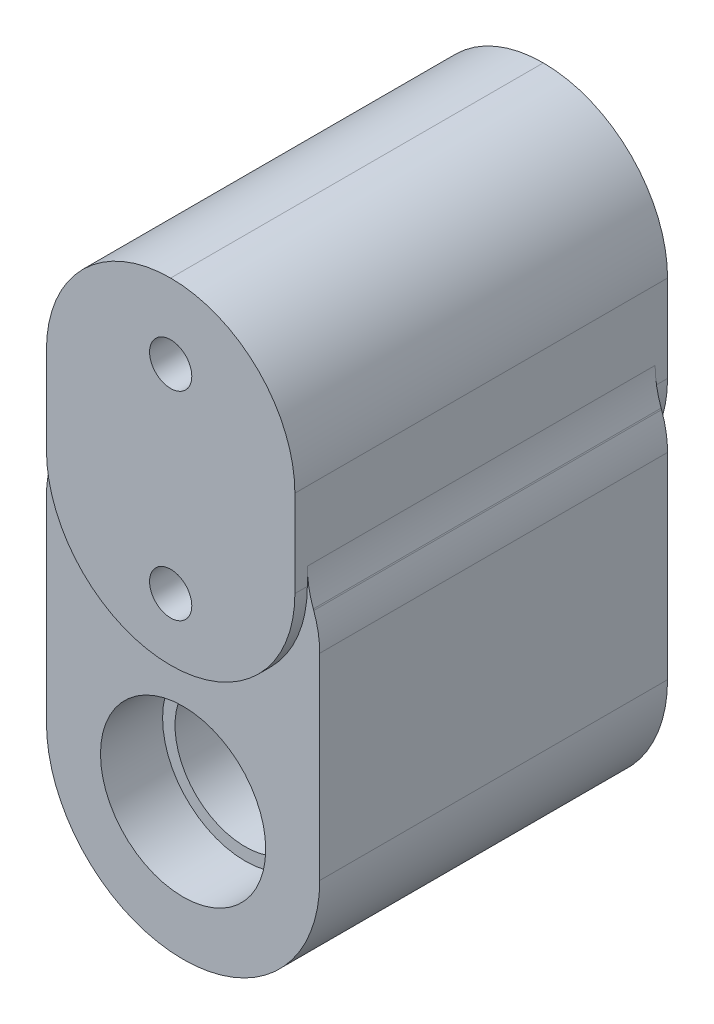
ISO-10303-21;
HEADER;
FILE_DESCRIPTION(('STEP AP214'),'2;1');
FILE_NAME('part.step','',(''),(''),'','','');
FILE_SCHEMA(('AUTOMOTIVE_DESIGN { 1 0 10303 214 1 1 1 1 }'));
ENDSEC;
DATA;
#1=APPLICATION_CONTEXT('core data for automotive mechanical design processes');
#2=APPLICATION_PROTOCOL_DEFINITION('international standard','automotive_design',2000,#1);
#3=PRODUCT_CONTEXT('',#1,'mechanical');
#4=PRODUCT('Part','Part','',(#3));
#5=PRODUCT_RELATED_PRODUCT_CATEGORY('part','',(#4));
#6=PRODUCT_DEFINITION_FORMATION('','',#4);
#7=PRODUCT_DEFINITION_CONTEXT('part definition',#1,'design');
#8=PRODUCT_DEFINITION('design','',#6,#7);
#9=PRODUCT_DEFINITION_SHAPE('','',#8);
#10=(LENGTH_UNIT() NAMED_UNIT(*) SI_UNIT(.MILLI.,.METRE.));
#11=(NAMED_UNIT(*) PLANE_ANGLE_UNIT() SI_UNIT($,.RADIAN.));
#12=(NAMED_UNIT(*) SI_UNIT($,.STERADIAN.) SOLID_ANGLE_UNIT());
#13=UNCERTAINTY_MEASURE_WITH_UNIT(LENGTH_MEASURE(1.E-05),#10,'distance_accuracy_value','');
#14=(GEOMETRIC_REPRESENTATION_CONTEXT(3) GLOBAL_UNCERTAINTY_ASSIGNED_CONTEXT((#13)) GLOBAL_UNIT_ASSIGNED_CONTEXT((#10,
#11,#12)) REPRESENTATION_CONTEXT('',''));
#15=CARTESIAN_POINT('',(0.,0.,0.));
#16=DIRECTION('',(0.,0.,1.));
#17=DIRECTION('',(1.,0.,0.));
#18=AXIS2_PLACEMENT_3D('',#15,#16,#17);
#19=CARTESIAN_POINT('',(0.,0.,-14.));
#20=DIRECTION('',(0.,0.,1.));
#21=DIRECTION('',(1.,0.,0.));
#22=AXIS2_PLACEMENT_3D('',#19,#20,#21);
#23=CYLINDRICAL_SURFACE('',#22,5.65);
#24=CARTESIAN_POINT('',(0.,0.,9.));
#25=DIRECTION('',(0.,0.,1.));
#26=DIRECTION('',(1.,0.,0.));
#27=AXIS2_PLACEMENT_3D('',#24,#25,#26);
#28=CIRCLE('',#27,5.65);
#29=CARTESIAN_POINT('',(5.65,0.,9.));
#30=VERTEX_POINT('',#29);
#31=EDGE_CURVE('E207',#30,#30,#28,.T.);
#32=ORIENTED_EDGE('',*,*,#31,.T.);
#33=EDGE_LOOP('',(#32));
#34=FACE_BOUND('',#33,.T.);
#35=CARTESIAN_POINT('',(0.,0.,-9.));
#36=DIRECTION('',(0.,0.,-1.));
#37=DIRECTION('',(-1.,0.,0.));
#38=AXIS2_PLACEMENT_3D('',#35,#36,#37);
#39=CIRCLE('',#38,5.65);
#40=CARTESIAN_POINT('',(-5.65,0.,-9.));
#41=VERTEX_POINT('',#40);
#42=EDGE_CURVE('E204',#41,#41,#39,.F.);
#43=ORIENTED_EDGE('',*,*,#42,.F.);
#44=EDGE_LOOP('',(#43));
#45=FACE_BOUND('',#44,.T.);
#46=ADVANCED_FACE('F37',(#34,#45),#23,.F.);
#47=CARTESIAN_POINT('',(11.,37.,-14.));
#48=DIRECTION('',(1.,0.,0.));
#49=DIRECTION('',(0.,1.,0.));
#50=AXIS2_PLACEMENT_3D('',#47,#48,#49);
#51=PLANE('',#50);
#52=DIRECTION('',(0.,1.,0.));
#53=VECTOR('',#52,1.);
#54=CARTESIAN_POINT('',(11.,37.,-14.));
#55=LINE('',#54,#53);
#56=CARTESIAN_POINT('',(11.,0.,-14.));
#57=VERTEX_POINT('',#56);
#58=CARTESIAN_POINT('',(11.,15.8419067348776,-14.));
#59=VERTEX_POINT('',#58);
#60=EDGE_CURVE('E220',#57,#59,#55,.T.);
#61=ORIENTED_EDGE('',*,*,#60,.T.);
#62=DIRECTION('',(0.,0.,1.));
#63=VECTOR('',#62,1.);
#64=CARTESIAN_POINT('',(11.,15.8419067348776,14.));
#65=LINE('',#64,#63);
#66=CARTESIAN_POINT('',(11.,15.8419067348776,14.));
#67=VERTEX_POINT('',#66);
#68=EDGE_CURVE('E253',#59,#67,#65,.T.);
#69=ORIENTED_EDGE('',*,*,#68,.T.);
#70=DIRECTION('',(0.,1.,0.));
#71=VECTOR('',#70,1.);
#72=CARTESIAN_POINT('',(11.,37.,14.));
#73=LINE('',#72,#71);
#74=CARTESIAN_POINT('',(11.,0.,14.));
#75=VERTEX_POINT('',#74);
#76=EDGE_CURVE('E214',#75,#67,#73,.T.);
#77=ORIENTED_EDGE('',*,*,#76,.F.);
#78=DIRECTION('',(0.,0.,1.));
#79=VECTOR('',#78,1.);
#80=CARTESIAN_POINT('',(11.,0.,-14.));
#81=LINE('',#80,#79);
#82=EDGE_CURVE('E231',#75,#57,#81,.F.);
#83=ORIENTED_EDGE('',*,*,#82,.T.);
#84=EDGE_LOOP('',(#61,#69,#77,#83));
#85=FACE_BOUND('',#84,.T.);
#86=ADVANCED_FACE('F388',(#85),#51,.T.);
#87=CARTESIAN_POINT('',(-11.,37.,-14.));
#88=DIRECTION('',(-1.,0.,0.));
#89=DIRECTION('',(0.,-1.,0.));
#90=AXIS2_PLACEMENT_3D('',#87,#88,#89);
#91=PLANE('',#90);
#92=DIRECTION('',(0.,-1.,0.));
#93=VECTOR('',#92,1.);
#94=CARTESIAN_POINT('',(-11.,37.,14.));
#95=LINE('',#94,#93);
#96=CARTESIAN_POINT('',(-11.,15.8419067348776,14.));
#97=VERTEX_POINT('',#96);
#98=CARTESIAN_POINT('',(-11.,0.,14.));
#99=VERTEX_POINT('',#98);
#100=EDGE_CURVE('E218',#97,#99,#95,.T.);
#101=ORIENTED_EDGE('',*,*,#100,.F.);
#102=DIRECTION('',(0.,0.,1.));
#103=VECTOR('',#102,1.);
#104=CARTESIAN_POINT('',(-11.,15.8419067348776,-14.));
#105=LINE('',#104,#103);
#106=CARTESIAN_POINT('',(-11.,15.8419067348776,-14.));
#107=VERTEX_POINT('',#106);
#108=EDGE_CURVE('E271',#97,#107,#105,.F.);
#109=ORIENTED_EDGE('',*,*,#108,.T.);
#110=DIRECTION('',(0.,-1.,0.));
#111=VECTOR('',#110,1.);
#112=CARTESIAN_POINT('',(-11.,37.,-14.));
#113=LINE('',#112,#111);
#114=CARTESIAN_POINT('',(-11.,0.,-14.));
#115=VERTEX_POINT('',#114);
#116=EDGE_CURVE('E223',#107,#115,#113,.T.);
#117=ORIENTED_EDGE('',*,*,#116,.T.);
#118=DIRECTION('',(0.,0.,1.));
#119=VECTOR('',#118,1.);
#120=CARTESIAN_POINT('',(-11.,0.,-14.));
#121=LINE('',#120,#119);
#122=EDGE_CURVE('E239',#115,#99,#121,.T.);
#123=ORIENTED_EDGE('',*,*,#122,.T.);
#124=EDGE_LOOP('',(#101,#109,#117,#123));
#125=FACE_BOUND('',#124,.T.);
#126=ADVANCED_FACE('F375',(#125),#91,.T.);
#127=CARTESIAN_POINT('',(0.,0.,-14.));
#128=DIRECTION('',(0.,0.,1.));
#129=DIRECTION('',(1.,0.,0.));
#130=AXIS2_PLACEMENT_3D('',#127,#128,#129);
#131=PLANE('',#130);
#132=CARTESIAN_POINT('',(0.,0.,-14.));
#133=DIRECTION('',(0.,0.,1.));
#134=DIRECTION('',(1.,0.,0.));
#135=AXIS2_PLACEMENT_3D('',#132,#133,#134);
#136=CIRCLE('',#135,6.65);
#137=CARTESIAN_POINT('',(6.65,0.,-14.));
#138=VERTEX_POINT('',#137);
#139=EDGE_CURVE('E196',#138,#138,#136,.T.);
#140=ORIENTED_EDGE('',*,*,#139,.T.);
#141=EDGE_LOOP('',(#140));
#142=FACE_BOUND('',#141,.T.);
#143=DIRECTION('',(-0.342020143325663,0.93969262078591,0.));
#144=VECTOR('',#143,1.);
#145=CARTESIAN_POINT('',(11.,17.2525225805453,-14.));
#146=LINE('',#145,#144);
#147=CARTESIAN_POINT('',(10.5175409662873,18.5780678814829,-14.));
#148=VERTEX_POINT('',#147);
#149=CARTESIAN_POINT('',(10.4824590337127,18.6744546990624,-14.));
#150=VERTEX_POINT('',#149);
#151=EDGE_CURVE('E305',#148,#150,#146,.T.);
#152=ORIENTED_EDGE('',*,*,#151,.F.);
#153=CARTESIAN_POINT('',(3.,15.8419067348776,-14.));
#154=DIRECTION('',(0.,0.,1.));
#155=DIRECTION('',(1.,0.,0.));
#156=AXIS2_PLACEMENT_3D('',#153,#154,#155);
#157=CIRCLE('',#156,8.);
#158=EDGE_CURVE('E262',#148,#59,#157,.F.);
#159=ORIENTED_EDGE('',*,*,#158,.T.);
#160=ORIENTED_EDGE('',*,*,#60,.F.);
#161=CARTESIAN_POINT('',(0.,0.,-14.));
#162=DIRECTION('',(0.,0.,1.));
#163=DIRECTION('',(1.,0.,0.));
#164=AXIS2_PLACEMENT_3D('',#161,#162,#163);
#165=CIRCLE('',#164,11.);
#166=CARTESIAN_POINT('',(0.,-11.,-14.));
#167=VERTEX_POINT('',#166);
#168=EDGE_CURVE('E237',#57,#167,#165,.F.);
#169=ORIENTED_EDGE('',*,*,#168,.T.);
#170=CARTESIAN_POINT('',(0.,0.,-14.));
#171=DIRECTION('',(0.,0.,1.));
#172=DIRECTION('',(1.,0.,0.));
#173=AXIS2_PLACEMENT_3D('',#170,#171,#172);
#174=CIRCLE('',#173,11.);
#175=EDGE_CURVE('E234',#167,#115,#174,.F.);
#176=ORIENTED_EDGE('',*,*,#175,.T.);
#177=ORIENTED_EDGE('',*,*,#116,.F.);
#178=CARTESIAN_POINT('',(-3.,15.8419067348776,-14.));
#179=DIRECTION('',(0.,0.,1.));
#180=DIRECTION('',(1.,0.,0.));
#181=AXIS2_PLACEMENT_3D('',#178,#179,#180);
#182=CIRCLE('',#181,8.);
#183=CARTESIAN_POINT('',(-10.5175409662873,18.5780678814829,-14.));
#184=VERTEX_POINT('',#183);
#185=EDGE_CURVE('E260',#107,#184,#182,.F.);
#186=ORIENTED_EDGE('',*,*,#185,.T.);
#187=DIRECTION('',(-0.342020143325663,-0.93969262078591,0.));
#188=VECTOR('',#187,1.);
#189=CARTESIAN_POINT('',(-11.,17.2525225805453,-14.));
#190=LINE('',#189,#188);
#191=CARTESIAN_POINT('',(-10.4824590337127,18.6744546990624,-14.));
#192=VERTEX_POINT('',#191);
#193=EDGE_CURVE('E313',#192,#184,#190,.T.);
#194=ORIENTED_EDGE('',*,*,#193,.F.);
#195=CARTESIAN_POINT('',(-18.,21.4106158456677,-14.));
#196=DIRECTION('',(0.,0.,1.));
#197=DIRECTION('',(1.,0.,0.));
#198=AXIS2_PLACEMENT_3D('',#195,#196,#197);
#199=CIRCLE('',#198,8.);
#200=CARTESIAN_POINT('',(-10.,21.4106158456677,-14.));
#201=VERTEX_POINT('',#200);
#202=EDGE_CURVE('E279',#192,#201,#199,.T.);
#203=ORIENTED_EDGE('',*,*,#202,.T.);
#204=DIRECTION('',(0.,1.,0.));
#205=VECTOR('',#204,1.);
#206=CARTESIAN_POINT('',(-10.,0.,-14.));
#207=LINE('',#206,#205);
#208=CARTESIAN_POINT('',(-10.,20.,-14.));
#209=VERTEX_POINT('',#208);
#210=EDGE_CURVE('E264',#209,#201,#207,.T.);
#211=ORIENTED_EDGE('',*,*,#210,.F.);
#212=CARTESIAN_POINT('',(0.,20.,-14.));
#213=DIRECTION('',(0.,0.,1.));
#214=DIRECTION('',(1.,0.,0.));
#215=AXIS2_PLACEMENT_3D('',#212,#213,#214);
#216=CIRCLE('',#215,10.);
#217=CARTESIAN_POINT('',(10.,20.,-14.));
#218=VERTEX_POINT('',#217);
#219=EDGE_CURVE('E325',#209,#218,#216,.T.);
#220=ORIENTED_EDGE('',*,*,#219,.T.);
#221=DIRECTION('',(0.,-1.,0.));
#222=VECTOR('',#221,1.);
#223=CARTESIAN_POINT('',(10.,0.,-14.));
#224=LINE('',#223,#222);
#225=CARTESIAN_POINT('',(10.,21.4106158456677,-14.));
#226=VERTEX_POINT('',#225);
#227=EDGE_CURVE('E247',#226,#218,#224,.T.);
#228=ORIENTED_EDGE('',*,*,#227,.F.);
#229=CARTESIAN_POINT('',(18.,21.4106158456677,-14.));
#230=DIRECTION('',(0.,0.,1.));
#231=DIRECTION('',(1.,0.,0.));
#232=AXIS2_PLACEMENT_3D('',#229,#230,#231);
#233=CIRCLE('',#232,8.);
#234=EDGE_CURVE('E275',#226,#150,#233,.T.);
#235=ORIENTED_EDGE('',*,*,#234,.T.);
#236=EDGE_LOOP('',(#152,#159,#160,#169,#176,#177,#186,#194,#203,#211,#220,#228,#235));
#237=FACE_BOUND('',#236,.T.);
#238=ADVANCED_FACE('F352',(#142,#237),#131,.F.);
#239=CARTESIAN_POINT('',(0.,0.,14.));
#240=DIRECTION('',(0.,0.,1.));
#241=DIRECTION('',(1.,0.,0.));
#242=AXIS2_PLACEMENT_3D('',#239,#240,#241);
#243=PLANE('',#242);
#244=ORIENTED_EDGE('',*,*,#76,.T.);
#245=CARTESIAN_POINT('',(3.,15.8419067348776,14.));
#246=DIRECTION('',(0.,0.,1.));
#247=DIRECTION('',(1.,0.,0.));
#248=AXIS2_PLACEMENT_3D('',#245,#246,#247);
#249=CIRCLE('',#248,8.);
#250=CARTESIAN_POINT('',(10.5175409662873,18.5780678814829,14.));
#251=VERTEX_POINT('',#250);
#252=EDGE_CURVE('E258',#67,#251,#249,.T.);
#253=ORIENTED_EDGE('',*,*,#252,.T.);
#254=DIRECTION('',(0.342020143325663,-0.93969262078591,0.));
#255=VECTOR('',#254,1.);
#256=CARTESIAN_POINT('',(11.,17.2525225805453,14.));
#257=LINE('',#256,#255);
#258=CARTESIAN_POINT('',(10.4824590337127,18.6744546990624,14.));
#259=VERTEX_POINT('',#258);
#260=EDGE_CURVE('E307',#259,#251,#257,.T.);
#261=ORIENTED_EDGE('',*,*,#260,.F.);
#262=CARTESIAN_POINT('',(18.,21.4106158456677,14.));
#263=DIRECTION('',(0.,0.,1.));
#264=DIRECTION('',(1.,0.,0.));
#265=AXIS2_PLACEMENT_3D('',#262,#263,#264);
#266=CIRCLE('',#265,8.);
#267=CARTESIAN_POINT('',(10.,21.4106158456677,14.));
#268=VERTEX_POINT('',#267);
#269=EDGE_CURVE('E273',#259,#268,#266,.F.);
#270=ORIENTED_EDGE('',*,*,#269,.T.);
#271=DIRECTION('',(0.,1.,0.));
#272=VECTOR('',#271,1.);
#273=CARTESIAN_POINT('',(10.,37.,14.));
#274=LINE('',#273,#272);
#275=CARTESIAN_POINT('',(10.,20.,14.));
#276=VERTEX_POINT('',#275);
#277=EDGE_CURVE('E182',#276,#268,#274,.T.);
#278=ORIENTED_EDGE('',*,*,#277,.F.);
#279=CARTESIAN_POINT('',(0.,20.,14.));
#280=DIRECTION('',(0.,0.,1.));
#281=DIRECTION('',(1.,0.,0.));
#282=AXIS2_PLACEMENT_3D('',#279,#280,#281);
#283=CIRCLE('',#282,10.);
#284=CARTESIAN_POINT('',(-10.,20.,14.));
#285=VERTEX_POINT('',#284);
#286=EDGE_CURVE('E177',#285,#276,#283,.T.);
#287=ORIENTED_EDGE('',*,*,#286,.F.);
#288=DIRECTION('',(0.,-1.,0.));
#289=VECTOR('',#288,1.);
#290=CARTESIAN_POINT('',(-10.,20.,14.));
#291=LINE('',#290,#289);
#292=CARTESIAN_POINT('',(-10.,21.4106158456677,14.));
#293=VERTEX_POINT('',#292);
#294=EDGE_CURVE('E164',#293,#285,#291,.T.);
#295=ORIENTED_EDGE('',*,*,#294,.F.);
#296=CARTESIAN_POINT('',(-18.,21.4106158456677,14.));
#297=DIRECTION('',(0.,0.,1.));
#298=DIRECTION('',(1.,0.,0.));
#299=AXIS2_PLACEMENT_3D('',#296,#297,#298);
#300=CIRCLE('',#299,8.);
#301=CARTESIAN_POINT('',(-10.4824590337127,18.6744546990624,14.));
#302=VERTEX_POINT('',#301);
#303=EDGE_CURVE('E277',#293,#302,#300,.F.);
#304=ORIENTED_EDGE('',*,*,#303,.T.);
#305=DIRECTION('',(0.342020143325663,0.93969262078591,0.));
#306=VECTOR('',#305,1.);
#307=CARTESIAN_POINT('',(-11.,17.2525225805453,14.));
#308=LINE('',#307,#306);
#309=CARTESIAN_POINT('',(-10.5175409662873,18.5780678814829,14.));
#310=VERTEX_POINT('',#309);
#311=EDGE_CURVE('E316',#310,#302,#308,.T.);
#312=ORIENTED_EDGE('',*,*,#311,.F.);
#313=CARTESIAN_POINT('',(-3.,15.8419067348776,14.));
#314=DIRECTION('',(0.,0.,1.));
#315=DIRECTION('',(1.,0.,0.));
#316=AXIS2_PLACEMENT_3D('',#313,#314,#315);
#317=CIRCLE('',#316,8.);
#318=EDGE_CURVE('E256',#310,#97,#317,.T.);
#319=ORIENTED_EDGE('',*,*,#318,.T.);
#320=ORIENTED_EDGE('',*,*,#100,.T.);
#321=CARTESIAN_POINT('',(0.,0.,14.));
#322=DIRECTION('',(0.,0.,1.));
#323=DIRECTION('',(1.,0.,0.));
#324=AXIS2_PLACEMENT_3D('',#321,#322,#323);
#325=CIRCLE('',#324,11.);
#326=CARTESIAN_POINT('',(0.,-11.,14.));
#327=VERTEX_POINT('',#326);
#328=EDGE_CURVE('E225',#99,#327,#325,.T.);
#329=ORIENTED_EDGE('',*,*,#328,.T.);
#330=CARTESIAN_POINT('',(0.,0.,14.));
#331=DIRECTION('',(0.,0.,1.));
#332=DIRECTION('',(1.,0.,0.));
#333=AXIS2_PLACEMENT_3D('',#330,#331,#332);
#334=CIRCLE('',#333,11.);
#335=EDGE_CURVE('E229',#327,#75,#334,.T.);
#336=ORIENTED_EDGE('',*,*,#335,.T.);
#337=EDGE_LOOP('',(#244,#253,#261,#270,#278,#287,#295,#304,#312,#319,#320,#329,#336));
#338=FACE_BOUND('',#337,.T.);
#339=CARTESIAN_POINT('',(0.,0.,14.));
#340=DIRECTION('',(0.,0.,1.));
#341=DIRECTION('',(1.,0.,0.));
#342=AXIS2_PLACEMENT_3D('',#339,#340,#341);
#343=CIRCLE('',#342,6.65);
#344=CARTESIAN_POINT('',(6.65,0.,14.));
#345=VERTEX_POINT('',#344);
#346=EDGE_CURVE('E210',#345,#345,#343,.T.);
#347=ORIENTED_EDGE('',*,*,#346,.F.);
#348=EDGE_LOOP('',(#347));
#349=FACE_BOUND('',#348,.T.);
#350=ADVANCED_FACE('F179',(#338,#349),#243,.T.);
#351=CARTESIAN_POINT('',(0.,0.,9.));
#352=DIRECTION('',(0.,0.,1.));
#353=DIRECTION('',(1.,0.,0.));
#354=AXIS2_PLACEMENT_3D('',#351,#352,#353);
#355=CYLINDRICAL_SURFACE('',#354,6.65);
#356=CARTESIAN_POINT('',(0.,0.,9.));
#357=DIRECTION('',(0.,0.,1.));
#358=DIRECTION('',(1.,0.,0.));
#359=AXIS2_PLACEMENT_3D('',#356,#357,#358);
#360=CIRCLE('',#359,6.65);
#361=CARTESIAN_POINT('',(6.65,0.,9.));
#362=VERTEX_POINT('',#361);
#363=EDGE_CURVE('E211',#362,#362,#360,.T.);
#364=ORIENTED_EDGE('',*,*,#363,.F.);
#365=EDGE_LOOP('',(#364));
#366=FACE_BOUND('',#365,.T.);
#367=ORIENTED_EDGE('',*,*,#346,.T.);
#368=EDGE_LOOP('',(#367));
#369=FACE_BOUND('',#368,.T.);
#370=ADVANCED_FACE('F422',(#366,#369),#355,.F.);
#371=CARTESIAN_POINT('',(0.,0.,9.));
#372=DIRECTION('',(0.,0.,1.));
#373=DIRECTION('',(1.,0.,0.));
#374=AXIS2_PLACEMENT_3D('',#371,#372,#373);
#375=PLANE('',#374);
#376=ORIENTED_EDGE('',*,*,#31,.F.);
#377=EDGE_LOOP('',(#376));
#378=FACE_BOUND('',#377,.T.);
#379=ORIENTED_EDGE('',*,*,#363,.T.);
#380=EDGE_LOOP('',(#379));
#381=FACE_BOUND('',#380,.T.);
#382=ADVANCED_FACE('F418',(#378,#381),#375,.T.);
#383=CARTESIAN_POINT('',(0.,0.,-9.));
#384=DIRECTION('',(0.,0.,-1.));
#385=DIRECTION('',(1.,0.,0.));
#386=AXIS2_PLACEMENT_3D('',#383,#384,#385);
#387=PLANE('',#386);
#388=CARTESIAN_POINT('',(0.,0.,-9.));
#389=DIRECTION('',(0.,0.,1.));
#390=DIRECTION('',(1.,0.,0.));
#391=AXIS2_PLACEMENT_3D('',#388,#389,#390);
#392=CIRCLE('',#391,6.65);
#393=CARTESIAN_POINT('',(6.65,0.,-9.));
#394=VERTEX_POINT('',#393);
#395=EDGE_CURVE('E201',#394,#394,#392,.T.);
#396=ORIENTED_EDGE('',*,*,#395,.F.);
#397=EDGE_LOOP('',(#396));
#398=FACE_BOUND('',#397,.T.);
#399=ORIENTED_EDGE('',*,*,#42,.T.);
#400=EDGE_LOOP('',(#399));
#401=FACE_BOUND('',#400,.T.);
#402=ADVANCED_FACE('F421',(#398,#401),#387,.T.);
#403=CARTESIAN_POINT('',(0.,0.,-9.));
#404=DIRECTION('',(0.,0.,-1.));
#405=DIRECTION('',(-1.,0.,0.));
#406=AXIS2_PLACEMENT_3D('',#403,#404,#405);
#407=CYLINDRICAL_SURFACE('',#406,6.65);
#408=ORIENTED_EDGE('',*,*,#395,.T.);
#409=EDGE_LOOP('',(#408));
#410=FACE_BOUND('',#409,.T.);
#411=ORIENTED_EDGE('',*,*,#139,.F.);
#412=EDGE_LOOP('',(#411));
#413=FACE_BOUND('',#412,.T.);
#414=ADVANCED_FACE('F416',(#410,#413),#407,.F.);
#415=CARTESIAN_POINT('',(0.,0.,-14.));
#416=DIRECTION('',(0.,0.,1.));
#417=DIRECTION('',(1.,0.,0.));
#418=AXIS2_PLACEMENT_3D('',#415,#416,#417);
#419=CYLINDRICAL_SURFACE('',#418,11.);
#420=ORIENTED_EDGE('',*,*,#122,.F.);
#421=ORIENTED_EDGE('',*,*,#175,.F.);
#422=DIRECTION('',(0.,0.,1.));
#423=VECTOR('',#422,1.);
#424=CARTESIAN_POINT('',(0.,-11.,-14.));
#425=LINE('',#424,#423);
#426=EDGE_CURVE('E192',#327,#167,#425,.F.);
#427=ORIENTED_EDGE('',*,*,#426,.F.);
#428=ORIENTED_EDGE('',*,*,#328,.F.);
#429=EDGE_LOOP('',(#420,#421,#427,#428));
#430=FACE_BOUND('',#429,.T.);
#431=ADVANCED_FACE('F382',(#430),#419,.T.);
#432=CARTESIAN_POINT('',(0.,0.,-14.));
#433=DIRECTION('',(0.,0.,1.));
#434=DIRECTION('',(1.,0.,0.));
#435=AXIS2_PLACEMENT_3D('',#432,#433,#434);
#436=CYLINDRICAL_SURFACE('',#435,11.);
#437=ORIENTED_EDGE('',*,*,#168,.F.);
#438=ORIENTED_EDGE('',*,*,#82,.F.);
#439=ORIENTED_EDGE('',*,*,#335,.F.);
#440=ORIENTED_EDGE('',*,*,#426,.T.);
#441=EDGE_LOOP('',(#437,#438,#439,#440));
#442=FACE_BOUND('',#441,.T.);
#443=ADVANCED_FACE('F391',(#442),#436,.T.);
#444=CARTESIAN_POINT('',(0.,31.,14.));
#445=DIRECTION('',(0.,0.,-1.));
#446=DIRECTION('',(-1.,0.,0.));
#447=AXIS2_PLACEMENT_3D('',#444,#445,#446);
#448=CYLINDRICAL_SURFACE('',#447,1.7);
#449=CARTESIAN_POINT('',(0.,31.,15.));
#450=DIRECTION('',(0.,0.,1.));
#451=DIRECTION('',(1.,0.,0.));
#452=AXIS2_PLACEMENT_3D('',#449,#450,#451);
#453=CIRCLE('',#452,1.7);
#454=CARTESIAN_POINT('',(1.7,31.,15.));
#455=VERTEX_POINT('',#454);
#456=EDGE_CURVE('E187',#455,#455,#453,.T.);
#457=ORIENTED_EDGE('',*,*,#456,.T.);
#458=EDGE_LOOP('',(#457));
#459=FACE_BOUND('',#458,.T.);
#460=CARTESIAN_POINT('',(0.,31.,-15.));
#461=DIRECTION('',(0.,0.,1.));
#462=DIRECTION('',(1.,0.,0.));
#463=AXIS2_PLACEMENT_3D('',#460,#461,#462);
#464=CIRCLE('',#463,1.7);
#465=CARTESIAN_POINT('',(1.7,31.,-15.));
#466=VERTEX_POINT('',#465);
#467=EDGE_CURVE('E322',#466,#466,#464,.T.);
#468=ORIENTED_EDGE('',*,*,#467,.F.);
#469=EDGE_LOOP('',(#468));
#470=FACE_BOUND('',#469,.T.);
#471=ADVANCED_FACE('F436',(#459,#470),#448,.F.);
#472=CARTESIAN_POINT('',(0.,15.,14.));
#473=DIRECTION('',(0.,0.,-1.));
#474=DIRECTION('',(-1.,0.,0.));
#475=AXIS2_PLACEMENT_3D('',#472,#473,#474);
#476=CYLINDRICAL_SURFACE('',#475,1.7);
#477=CARTESIAN_POINT('',(0.,15.,15.));
#478=DIRECTION('',(0.,0.,1.));
#479=DIRECTION('',(1.,0.,0.));
#480=AXIS2_PLACEMENT_3D('',#477,#478,#479);
#481=CIRCLE('',#480,1.7);
#482=CARTESIAN_POINT('',(1.7,15.,15.));
#483=VERTEX_POINT('',#482);
#484=EDGE_CURVE('E340',#483,#483,#481,.T.);
#485=ORIENTED_EDGE('',*,*,#484,.T.);
#486=EDGE_LOOP('',(#485));
#487=FACE_BOUND('',#486,.T.);
#488=CARTESIAN_POINT('',(0.,15.,-15.));
#489=DIRECTION('',(0.,0.,1.));
#490=DIRECTION('',(1.,0.,0.));
#491=AXIS2_PLACEMENT_3D('',#488,#489,#490);
#492=CIRCLE('',#491,1.7);
#493=CARTESIAN_POINT('',(1.7,15.,-15.));
#494=VERTEX_POINT('',#493);
#495=EDGE_CURVE('E319',#494,#494,#492,.T.);
#496=ORIENTED_EDGE('',*,*,#495,.F.);
#497=EDGE_LOOP('',(#496));
#498=FACE_BOUND('',#497,.T.);
#499=ADVANCED_FACE('F531',(#487,#498),#476,.F.);
#500=CARTESIAN_POINT('',(0.,20.,15.));
#501=DIRECTION('',(0.,0.,1.));
#502=DIRECTION('',(1.,0.,0.));
#503=AXIS2_PLACEMENT_3D('',#500,#501,#502);
#504=PLANE('',#503);
#505=ORIENTED_EDGE('',*,*,#456,.F.);
#506=EDGE_LOOP('',(#505));
#507=FACE_BOUND('',#506,.T.);
#508=CARTESIAN_POINT('',(0.,27.,15.));
#509=DIRECTION('',(0.,0.,1.));
#510=DIRECTION('',(1.,0.,0.));
#511=AXIS2_PLACEMENT_3D('',#508,#509,#510);
#512=CIRCLE('',#511,10.);
#513=CARTESIAN_POINT('',(10.,27.,15.));
#514=VERTEX_POINT('',#513);
#515=CARTESIAN_POINT('',(0.,37.,15.));
#516=VERTEX_POINT('',#515);
#517=EDGE_CURVE('E53',#514,#516,#512,.T.);
#518=ORIENTED_EDGE('',*,*,#517,.T.);
#519=CARTESIAN_POINT('',(0.,27.,15.));
#520=DIRECTION('',(0.,0.,1.));
#521=DIRECTION('',(1.,0.,0.));
#522=AXIS2_PLACEMENT_3D('',#519,#520,#521);
#523=CIRCLE('',#522,10.);
#524=CARTESIAN_POINT('',(-10.,27.,15.));
#525=VERTEX_POINT('',#524);
#526=EDGE_CURVE('E46',#516,#525,#523,.T.);
#527=ORIENTED_EDGE('',*,*,#526,.T.);
#528=DIRECTION('',(0.,-1.,0.));
#529=VECTOR('',#528,1.);
#530=CARTESIAN_POINT('',(-10.,20.,15.));
#531=LINE('',#530,#529);
#532=CARTESIAN_POINT('',(-10.,20.,15.));
#533=VERTEX_POINT('',#532);
#534=EDGE_CURVE('E186',#525,#533,#531,.T.);
#535=ORIENTED_EDGE('',*,*,#534,.T.);
#536=CARTESIAN_POINT('',(0.,20.,15.));
#537=DIRECTION('',(0.,0.,1.));
#538=DIRECTION('',(1.,0.,0.));
#539=AXIS2_PLACEMENT_3D('',#536,#537,#538);
#540=CIRCLE('',#539,10.);
#541=CARTESIAN_POINT('',(10.,20.,15.));
#542=VERTEX_POINT('',#541);
#543=EDGE_CURVE('E191',#533,#542,#540,.T.);
#544=ORIENTED_EDGE('',*,*,#543,.T.);
#545=DIRECTION('',(0.,1.,0.));
#546=VECTOR('',#545,1.);
#547=CARTESIAN_POINT('',(10.,37.,15.));
#548=LINE('',#547,#546);
#549=EDGE_CURVE('E198',#542,#514,#548,.T.);
#550=ORIENTED_EDGE('',*,*,#549,.T.);
#551=EDGE_LOOP('',(#518,#527,#535,#544,#550));
#552=FACE_BOUND('',#551,.T.);
#553=ORIENTED_EDGE('',*,*,#484,.F.);
#554=EDGE_LOOP('',(#553));
#555=FACE_BOUND('',#554,.T.);
#556=ADVANCED_FACE('F290',(#507,#552,#555),#504,.T.);
#557=CARTESIAN_POINT('',(-10.,20.,15.));
#558=DIRECTION('',(1.,0.,0.));
#559=DIRECTION('',(0.,1.,0.));
#560=AXIS2_PLACEMENT_3D('',#557,#558,#559);
#561=PLANE('',#560);
#562=ORIENTED_EDGE('',*,*,#534,.F.);
#563=DIRECTION('',(0.,0.,-1.));
#564=VECTOR('',#563,1.);
#565=CARTESIAN_POINT('',(-10.,27.,-15.));
#566=LINE('',#565,#564);
#567=CARTESIAN_POINT('',(-10.,27.,-15.));
#568=VERTEX_POINT('',#567);
#569=EDGE_CURVE('E281',#525,#568,#566,.T.);
#570=ORIENTED_EDGE('',*,*,#569,.T.);
#571=DIRECTION('',(0.,-1.,0.));
#572=VECTOR('',#571,1.);
#573=CARTESIAN_POINT('',(-10.,20.,-15.));
#574=LINE('',#573,#572);
#575=CARTESIAN_POINT('',(-10.,20.,-15.));
#576=VERTEX_POINT('',#575);
#577=EDGE_CURVE('E303',#568,#576,#574,.T.);
#578=ORIENTED_EDGE('',*,*,#577,.T.);
#579=DIRECTION('',(0.,0.,1.));
#580=VECTOR('',#579,1.);
#581=CARTESIAN_POINT('',(-10.,20.,-15.));
#582=LINE('',#581,#580);
#583=EDGE_CURVE('E332',#576,#209,#582,.T.);
#584=ORIENTED_EDGE('',*,*,#583,.T.);
#585=ORIENTED_EDGE('',*,*,#210,.T.);
#586=DIRECTION('',(0.,0.,1.));
#587=VECTOR('',#586,1.);
#588=CARTESIAN_POINT('',(-10.,21.4106158456677,14.));
#589=LINE('',#588,#587);
#590=EDGE_CURVE('E172',#201,#293,#589,.T.);
#591=ORIENTED_EDGE('',*,*,#590,.T.);
#592=ORIENTED_EDGE('',*,*,#294,.T.);
#593=DIRECTION('',(0.,0.,-1.));
#594=VECTOR('',#593,1.);
#595=CARTESIAN_POINT('',(-10.,20.,15.));
#596=LINE('',#595,#594);
#597=EDGE_CURVE('E169',#533,#285,#596,.T.);
#598=ORIENTED_EDGE('',*,*,#597,.F.);
#599=EDGE_LOOP('',(#562,#570,#578,#584,#585,#591,#592,#598));
#600=FACE_BOUND('',#599,.T.);
#601=ADVANCED_FACE('F167',(#600),#561,.F.);
#602=CARTESIAN_POINT('',(0.,20.,15.));
#603=DIRECTION('',(0.,0.,-1.));
#604=DIRECTION('',(-1.,0.,0.));
#605=AXIS2_PLACEMENT_3D('',#602,#603,#604);
#606=CYLINDRICAL_SURFACE('',#605,10.);
#607=ORIENTED_EDGE('',*,*,#286,.T.);
#608=DIRECTION('',(0.,0.,-1.));
#609=VECTOR('',#608,1.);
#610=CARTESIAN_POINT('',(10.,20.,15.));
#611=LINE('',#610,#609);
#612=EDGE_CURVE('E193',#542,#276,#611,.T.);
#613=ORIENTED_EDGE('',*,*,#612,.F.);
#614=ORIENTED_EDGE('',*,*,#543,.F.);
#615=ORIENTED_EDGE('',*,*,#597,.T.);
#616=EDGE_LOOP('',(#607,#613,#614,#615));
#617=FACE_BOUND('',#616,.T.);
#618=ADVANCED_FACE('F190',(#617),#606,.T.);
#619=CARTESIAN_POINT('',(10.,37.,15.));
#620=DIRECTION('',(-1.,0.,0.));
#621=DIRECTION('',(0.,-1.,0.));
#622=AXIS2_PLACEMENT_3D('',#619,#620,#621);
#623=PLANE('',#622);
#624=DIRECTION('',(0.,1.,0.));
#625=VECTOR('',#624,1.);
#626=CARTESIAN_POINT('',(10.,37.,-15.));
#627=LINE('',#626,#625);
#628=CARTESIAN_POINT('',(10.,20.,-15.));
#629=VERTEX_POINT('',#628);
#630=CARTESIAN_POINT('',(10.,27.,-15.));
#631=VERTEX_POINT('',#630);
#632=EDGE_CURVE('E327',#629,#631,#627,.T.);
#633=ORIENTED_EDGE('',*,*,#632,.T.);
#634=DIRECTION('',(0.,0.,-1.));
#635=VECTOR('',#634,1.);
#636=CARTESIAN_POINT('',(10.,27.,15.));
#637=LINE('',#636,#635);
#638=EDGE_CURVE('E11',#631,#514,#637,.F.);
#639=ORIENTED_EDGE('',*,*,#638,.T.);
#640=ORIENTED_EDGE('',*,*,#549,.F.);
#641=ORIENTED_EDGE('',*,*,#612,.T.);
#642=ORIENTED_EDGE('',*,*,#277,.T.);
#643=DIRECTION('',(0.,0.,1.));
#644=VECTOR('',#643,1.);
#645=CARTESIAN_POINT('',(10.,21.4106158456677,-14.));
#646=LINE('',#645,#644);
#647=EDGE_CURVE('E249',#268,#226,#646,.F.);
#648=ORIENTED_EDGE('',*,*,#647,.T.);
#649=ORIENTED_EDGE('',*,*,#227,.T.);
#650=DIRECTION('',(0.,0.,1.));
#651=VECTOR('',#650,1.);
#652=CARTESIAN_POINT('',(10.,20.,-15.));
#653=LINE('',#652,#651);
#654=EDGE_CURVE('E337',#629,#218,#653,.T.);
#655=ORIENTED_EDGE('',*,*,#654,.F.);
#656=EDGE_LOOP('',(#633,#639,#640,#641,#642,#648,#649,#655));
#657=FACE_BOUND('',#656,.T.);
#658=ADVANCED_FACE('F346',(#657),#623,.F.);
#659=CARTESIAN_POINT('',(0.,20.,-15.));
#660=DIRECTION('',(0.,0.,1.));
#661=DIRECTION('',(1.,0.,0.));
#662=AXIS2_PLACEMENT_3D('',#659,#660,#661);
#663=CYLINDRICAL_SURFACE('',#662,10.);
#664=ORIENTED_EDGE('',*,*,#219,.F.);
#665=ORIENTED_EDGE('',*,*,#583,.F.);
#666=CARTESIAN_POINT('',(0.,20.,-15.));
#667=DIRECTION('',(0.,0.,1.));
#668=DIRECTION('',(1.,0.,0.));
#669=AXIS2_PLACEMENT_3D('',#666,#667,#668);
#670=CIRCLE('',#669,10.);
#671=EDGE_CURVE('E329',#576,#629,#670,.T.);
#672=ORIENTED_EDGE('',*,*,#671,.T.);
#673=ORIENTED_EDGE('',*,*,#654,.T.);
#674=EDGE_LOOP('',(#664,#665,#672,#673));
#675=FACE_BOUND('',#674,.T.);
#676=ADVANCED_FACE('F356',(#675),#663,.T.);
#677=CARTESIAN_POINT('',(0.,20.,-15.));
#678=DIRECTION('',(0.,0.,-1.));
#679=DIRECTION('',(1.,0.,0.));
#680=AXIS2_PLACEMENT_3D('',#677,#678,#679);
#681=PLANE('',#680);
#682=ORIENTED_EDGE('',*,*,#495,.T.);
#683=EDGE_LOOP('',(#682));
#684=FACE_BOUND('',#683,.T.);
#685=ORIENTED_EDGE('',*,*,#467,.T.);
#686=EDGE_LOOP('',(#685));
#687=FACE_BOUND('',#686,.T.);
#688=ORIENTED_EDGE('',*,*,#577,.F.);
#689=CARTESIAN_POINT('',(0.,27.,-15.));
#690=DIRECTION('',(0.,0.,-1.));
#691=DIRECTION('',(-1.,0.,0.));
#692=AXIS2_PLACEMENT_3D('',#689,#690,#691);
#693=CIRCLE('',#692,10.);
#694=CARTESIAN_POINT('',(0.,37.,-15.));
#695=VERTEX_POINT('',#694);
#696=EDGE_CURVE('E286',#568,#695,#693,.T.);
#697=ORIENTED_EDGE('',*,*,#696,.T.);
#698=CARTESIAN_POINT('',(0.,27.,-15.));
#699=DIRECTION('',(0.,0.,-1.));
#700=DIRECTION('',(-1.,0.,0.));
#701=AXIS2_PLACEMENT_3D('',#698,#699,#700);
#702=CIRCLE('',#701,10.);
#703=EDGE_CURVE('E284',#695,#631,#702,.T.);
#704=ORIENTED_EDGE('',*,*,#703,.T.);
#705=ORIENTED_EDGE('',*,*,#632,.F.);
#706=ORIENTED_EDGE('',*,*,#671,.F.);
#707=EDGE_LOOP('',(#688,#697,#704,#705,#706));
#708=FACE_BOUND('',#707,.T.);
#709=ADVANCED_FACE('F300',(#684,#687,#708),#681,.T.);
#710=CARTESIAN_POINT('',(11.,17.2525225805453,-15.001));
#711=DIRECTION('',(-0.93969262078591,-0.342020143325663,0.));
#712=DIRECTION('',(0.342020143325663,-0.93969262078591,0.));
#713=AXIS2_PLACEMENT_3D('',#710,#711,#712);
#714=PLANE('',#713);
#715=ORIENTED_EDGE('',*,*,#151,.T.);
#716=DIRECTION('',(0.,0.,1.));
#717=VECTOR('',#716,1.);
#718=CARTESIAN_POINT('',(10.4824590337127,18.6744546990624,14.));
#719=LINE('',#718,#717);
#720=EDGE_CURVE('E244',#150,#259,#719,.T.);
#721=ORIENTED_EDGE('',*,*,#720,.T.);
#722=ORIENTED_EDGE('',*,*,#260,.T.);
#723=DIRECTION('',(0.,0.,1.));
#724=VECTOR('',#723,1.);
#725=CARTESIAN_POINT('',(10.5175409662873,18.5780678814829,-14.));
#726=LINE('',#725,#724);
#727=EDGE_CURVE('E241',#251,#148,#726,.F.);
#728=ORIENTED_EDGE('',*,*,#727,.T.);
#729=EDGE_LOOP('',(#715,#721,#722,#728));
#730=FACE_BOUND('',#729,.T.);
#731=ADVANCED_FACE('F396',(#730),#714,.F.);
#732=CARTESIAN_POINT('',(-11.,17.2525225805453,-15.001));
#733=DIRECTION('',(0.93969262078591,-0.342020143325663,0.));
#734=DIRECTION('',(0.342020143325663,0.93969262078591,0.));
#735=AXIS2_PLACEMENT_3D('',#732,#733,#734);
#736=PLANE('',#735);
#737=ORIENTED_EDGE('',*,*,#311,.T.);
#738=DIRECTION('',(0.,0.,1.));
#739=VECTOR('',#738,1.);
#740=CARTESIAN_POINT('',(-10.4824590337127,18.6744546990624,-14.));
#741=LINE('',#740,#739);
#742=EDGE_CURVE('E269',#302,#192,#741,.F.);
#743=ORIENTED_EDGE('',*,*,#742,.T.);
#744=ORIENTED_EDGE('',*,*,#193,.T.);
#745=DIRECTION('',(0.,0.,1.));
#746=VECTOR('',#745,1.);
#747=CARTESIAN_POINT('',(-10.5175409662873,18.5780678814829,14.));
#748=LINE('',#747,#746);
#749=EDGE_CURVE('E174',#184,#310,#748,.T.);
#750=ORIENTED_EDGE('',*,*,#749,.T.);
#751=EDGE_LOOP('',(#737,#743,#744,#750));
#752=FACE_BOUND('',#751,.T.);
#753=ADVANCED_FACE('F365',(#752),#736,.F.);
#754=CARTESIAN_POINT('',(18.,21.4106158456677,-15.001));
#755=DIRECTION('',(0.,0.,-1.));
#756=DIRECTION('',(-1.,0.,0.));
#757=AXIS2_PLACEMENT_3D('',#754,#755,#756);
#758=CYLINDRICAL_SURFACE('',#757,8.);
#759=ORIENTED_EDGE('',*,*,#234,.F.);
#760=ORIENTED_EDGE('',*,*,#647,.F.);
#761=ORIENTED_EDGE('',*,*,#269,.F.);
#762=ORIENTED_EDGE('',*,*,#720,.F.);
#763=EDGE_LOOP('',(#759,#760,#761,#762));
#764=FACE_BOUND('',#763,.T.);
#765=ADVANCED_FACE('F350',(#764),#758,.F.);
#766=CARTESIAN_POINT('',(3.,15.8419067348776,-14.));
#767=DIRECTION('',(0.,0.,-1.));
#768=DIRECTION('',(-1.,0.,0.));
#769=AXIS2_PLACEMENT_3D('',#766,#767,#768);
#770=CYLINDRICAL_SURFACE('',#769,8.);
#771=ORIENTED_EDGE('',*,*,#158,.F.);
#772=ORIENTED_EDGE('',*,*,#727,.F.);
#773=ORIENTED_EDGE('',*,*,#252,.F.);
#774=ORIENTED_EDGE('',*,*,#68,.F.);
#775=EDGE_LOOP('',(#771,#772,#773,#774));
#776=FACE_BOUND('',#775,.T.);
#777=ADVANCED_FACE('F393',(#776),#770,.T.);
#778=CARTESIAN_POINT('',(-18.,21.4106158456677,15.));
#779=DIRECTION('',(0.,0.,-1.));
#780=DIRECTION('',(-1.,0.,0.));
#781=AXIS2_PLACEMENT_3D('',#778,#779,#780);
#782=CYLINDRICAL_SURFACE('',#781,8.);
#783=ORIENTED_EDGE('',*,*,#202,.F.);
#784=ORIENTED_EDGE('',*,*,#742,.F.);
#785=ORIENTED_EDGE('',*,*,#303,.F.);
#786=ORIENTED_EDGE('',*,*,#590,.F.);
#787=EDGE_LOOP('',(#783,#784,#785,#786));
#788=FACE_BOUND('',#787,.T.);
#789=ADVANCED_FACE('F360',(#788),#782,.F.);
#790=CARTESIAN_POINT('',(-3.,15.8419067348776,-15.001));
#791=DIRECTION('',(0.,0.,-1.));
#792=DIRECTION('',(-1.,0.,0.));
#793=AXIS2_PLACEMENT_3D('',#790,#791,#792);
#794=CYLINDRICAL_SURFACE('',#793,8.);
#795=ORIENTED_EDGE('',*,*,#185,.F.);
#796=ORIENTED_EDGE('',*,*,#108,.F.);
#797=ORIENTED_EDGE('',*,*,#318,.F.);
#798=ORIENTED_EDGE('',*,*,#749,.F.);
#799=EDGE_LOOP('',(#795,#796,#797,#798));
#800=FACE_BOUND('',#799,.T.);
#801=ADVANCED_FACE('F371',(#800),#794,.T.);
#802=CARTESIAN_POINT('',(0.,27.,-14.));
#803=DIRECTION('',(0.,0.,1.));
#804=DIRECTION('',(1.,0.,0.));
#805=AXIS2_PLACEMENT_3D('',#802,#803,#804);
#806=CYLINDRICAL_SURFACE('',#805,10.);
#807=DIRECTION('',(0.,0.,-1.));
#808=VECTOR('',#807,1.);
#809=CARTESIAN_POINT('',(0.,37.,-15.));
#810=LINE('',#809,#808);
#811=EDGE_CURVE('E41',#516,#695,#810,.T.);
#812=ORIENTED_EDGE('',*,*,#811,.F.);
#813=ORIENTED_EDGE('',*,*,#517,.F.);
#814=ORIENTED_EDGE('',*,*,#638,.F.);
#815=ORIENTED_EDGE('',*,*,#703,.F.);
#816=EDGE_LOOP('',(#812,#813,#814,#815));
#817=FACE_BOUND('',#816,.T.);
#818=ADVANCED_FACE('F39',(#817),#806,.T.);
#819=CARTESIAN_POINT('',(0.,27.,15.));
#820=DIRECTION('',(0.,0.,1.));
#821=DIRECTION('',(1.,0.,0.));
#822=AXIS2_PLACEMENT_3D('',#819,#820,#821);
#823=CYLINDRICAL_SURFACE('',#822,10.);
#824=ORIENTED_EDGE('',*,*,#526,.F.);
#825=ORIENTED_EDGE('',*,*,#811,.T.);
#826=ORIENTED_EDGE('',*,*,#696,.F.);
#827=ORIENTED_EDGE('',*,*,#569,.F.);
#828=EDGE_LOOP('',(#824,#825,#826,#827));
#829=FACE_BOUND('',#828,.T.);
#830=ADVANCED_FACE('F297',(#829),#823,.T.);
#831=CLOSED_SHELL('',(#46,#86,#126,#238,#350,#370,#382,#402,#414,#431,#443,#471,#499,#556,#601,
#618,#658,#676,#709,#731,#753,#765,#777,#789,#801,#818,#830));
#832=MANIFOLD_SOLID_BREP('B2',#831);
#833=ADVANCED_BREP_SHAPE_REPRESENTATION('',(#18,#832),#14);
#834=SHAPE_DEFINITION_REPRESENTATION(#9,#833);
ENDSEC;
END-ISO-10303-21;
